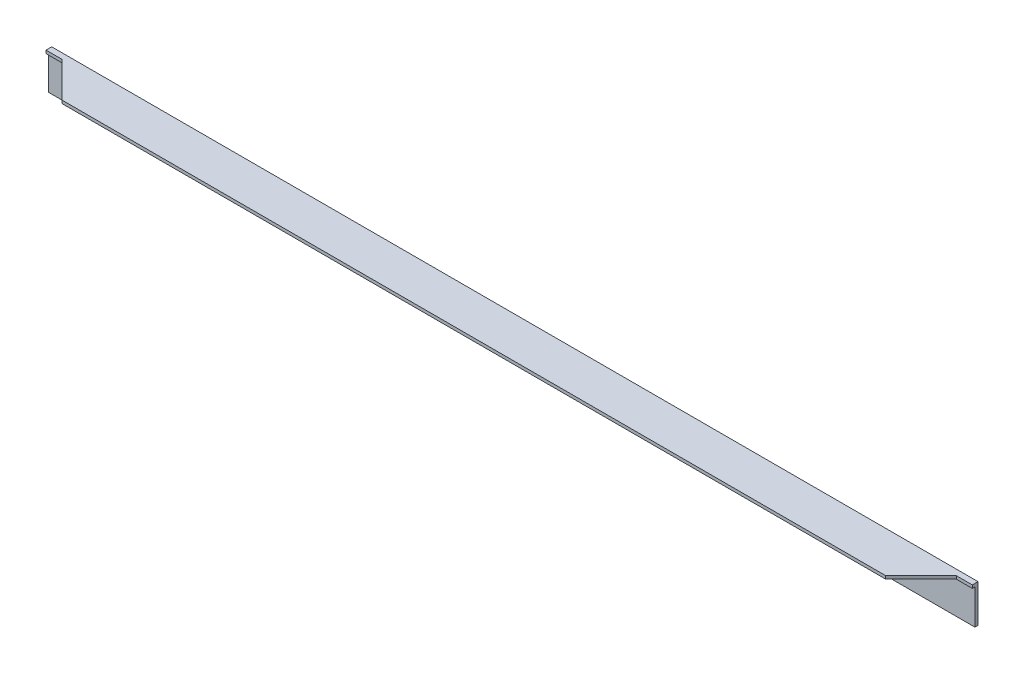
ISO-10303-21;
HEADER;
FILE_DESCRIPTION(('STEP AP214'),'2;1');
FILE_NAME('part.step','',(''),(''),'','','');
FILE_SCHEMA(('AUTOMOTIVE_DESIGN { 1 0 10303 214 1 1 1 1 }'));
ENDSEC;
DATA;
#1=APPLICATION_CONTEXT('core data for automotive mechanical design processes');
#2=APPLICATION_PROTOCOL_DEFINITION('international standard','automotive_design',2000,#1);
#3=PRODUCT_CONTEXT('',#1,'mechanical');
#4=PRODUCT('Part','Part','',(#3));
#5=PRODUCT_RELATED_PRODUCT_CATEGORY('part','',(#4));
#6=PRODUCT_DEFINITION_FORMATION('','',#4);
#7=PRODUCT_DEFINITION_CONTEXT('part definition',#1,'design');
#8=PRODUCT_DEFINITION('design','',#6,#7);
#9=PRODUCT_DEFINITION_SHAPE('','',#8);
#10=(LENGTH_UNIT() NAMED_UNIT(*) SI_UNIT(.MILLI.,.METRE.));
#11=(NAMED_UNIT(*) PLANE_ANGLE_UNIT() SI_UNIT($,.RADIAN.));
#12=(NAMED_UNIT(*) SI_UNIT($,.STERADIAN.) SOLID_ANGLE_UNIT());
#13=UNCERTAINTY_MEASURE_WITH_UNIT(LENGTH_MEASURE(1.E-05),#10,'distance_accuracy_value','');
#14=(GEOMETRIC_REPRESENTATION_CONTEXT(3) GLOBAL_UNCERTAINTY_ASSIGNED_CONTEXT((#13)) GLOBAL_UNIT_ASSIGNED_CONTEXT((#10,
#11,#12)) REPRESENTATION_CONTEXT('',''));
#15=CARTESIAN_POINT('',(0.,0.,0.));
#16=DIRECTION('',(0.,0.,1.));
#17=DIRECTION('',(1.,0.,0.));
#18=AXIS2_PLACEMENT_3D('',#15,#16,#17);
#19=CARTESIAN_POINT('',(-1220.,100.,8.));
#20=DIRECTION('',(0.,0.,-1.));
#21=DIRECTION('',(-1.,0.,0.));
#22=AXIS2_PLACEMENT_3D('',#19,#20,#21);
#23=PLANE('',#22);
#24=DIRECTION('',(1.,0.,0.));
#25=VECTOR('',#24,1.);
#26=CARTESIAN_POINT('',(-1220.,92.,8.));
#27=LINE('',#26,#25);
#28=CARTESIAN_POINT('',(-1220.,92.,8.));
#29=VERTEX_POINT('',#28);
#30=CARTESIAN_POINT('',(1220.,92.,8.));
#31=VERTEX_POINT('',#30);
#32=EDGE_CURVE('E134',#29,#31,#27,.T.);
#33=ORIENTED_EDGE('',*,*,#32,.F.);
#34=DIRECTION('',(0.,-1.,0.));
#35=VECTOR('',#34,1.);
#36=CARTESIAN_POINT('',(-1220.,0.,8.));
#37=LINE('',#36,#35);
#38=CARTESIAN_POINT('',(-1220.,0.,8.));
#39=VERTEX_POINT('',#38);
#40=EDGE_CURVE('E175',#29,#39,#37,.T.);
#41=ORIENTED_EDGE('',*,*,#40,.T.);
#42=DIRECTION('',(1.,0.,0.));
#43=VECTOR('',#42,1.);
#44=CARTESIAN_POINT('',(-1220.,0.,8.));
#45=LINE('',#44,#43);
#46=CARTESIAN_POINT('',(1220.,0.,8.));
#47=VERTEX_POINT('',#46);
#48=EDGE_CURVE('E185',#39,#47,#45,.T.);
#49=ORIENTED_EDGE('',*,*,#48,.T.);
#50=DIRECTION('',(0.,1.,0.));
#51=VECTOR('',#50,1.);
#52=CARTESIAN_POINT('',(1220.,0.,8.));
#53=LINE('',#52,#51);
#54=EDGE_CURVE('E147',#47,#31,#53,.T.);
#55=ORIENTED_EDGE('',*,*,#54,.T.);
#56=EDGE_LOOP('',(#33,#41,#49,#55));
#57=FACE_BOUND('',#56,.T.);
#58=ADVANCED_FACE('F34',(#57),#23,.F.);
#59=CARTESIAN_POINT('',(-1220.,0.,8.));
#60=DIRECTION('',(1.,0.,0.));
#61=DIRECTION('',(0.,0.,-1.));
#62=AXIS2_PLACEMENT_3D('',#59,#60,#61);
#63=PLANE('',#62);
#64=DIRECTION('',(0.,0.,-1.));
#65=VECTOR('',#64,1.);
#66=CARTESIAN_POINT('',(-1220.,92.,108.));
#67=LINE('',#66,#65);
#68=CARTESIAN_POINT('',(-1220.,92.,15.));
#69=VERTEX_POINT('',#68);
#70=EDGE_CURVE('E132',#69,#29,#67,.T.);
#71=ORIENTED_EDGE('',*,*,#70,.F.);
#72=DIRECTION('',(0.,1.,0.));
#73=VECTOR('',#72,1.);
#74=CARTESIAN_POINT('',(-1220.,-2.50000000007189E-05,15.));
#75=LINE('',#74,#73);
#76=CARTESIAN_POINT('',(-1220.,100.,15.));
#77=VERTEX_POINT('',#76);
#78=EDGE_CURVE('E212',#69,#77,#75,.T.);
#79=ORIENTED_EDGE('',*,*,#78,.T.);
#80=DIRECTION('',(0.,0.,-1.));
#81=VECTOR('',#80,1.);
#82=CARTESIAN_POINT('',(-1220.,100.,8.));
#83=LINE('',#82,#81);
#84=CARTESIAN_POINT('',(-1220.,100.,0.));
#85=VERTEX_POINT('',#84);
#86=EDGE_CURVE('E176',#77,#85,#83,.T.);
#87=ORIENTED_EDGE('',*,*,#86,.T.);
#88=DIRECTION('',(0.,-1.,0.));
#89=VECTOR('',#88,1.);
#90=CARTESIAN_POINT('',(-1220.,0.,0.));
#91=LINE('',#90,#89);
#92=CARTESIAN_POINT('',(-1220.,0.,0.));
#93=VERTEX_POINT('',#92);
#94=EDGE_CURVE('E156',#85,#93,#91,.T.);
#95=ORIENTED_EDGE('',*,*,#94,.T.);
#96=DIRECTION('',(0.,0.,-1.));
#97=VECTOR('',#96,1.);
#98=CARTESIAN_POINT('',(-1220.,0.,8.));
#99=LINE('',#98,#97);
#100=EDGE_CURVE('E183',#39,#93,#99,.T.);
#101=ORIENTED_EDGE('',*,*,#100,.F.);
#102=ORIENTED_EDGE('',*,*,#40,.F.);
#103=EDGE_LOOP('',(#71,#79,#87,#95,#101,#102));
#104=FACE_BOUND('',#103,.T.);
#105=ADVANCED_FACE('F36',(#104),#63,.F.);
#106=CARTESIAN_POINT('',(-1220.,0.,8.));
#107=DIRECTION('',(0.,1.,0.));
#108=DIRECTION('',(0.,0.,1.));
#109=AXIS2_PLACEMENT_3D('',#106,#107,#108);
#110=PLANE('',#109);
#111=DIRECTION('',(1.,0.,0.));
#112=VECTOR('',#111,1.);
#113=CARTESIAN_POINT('',(-1220.,0.,0.));
#114=LINE('',#113,#112);
#115=CARTESIAN_POINT('',(1220.,0.,0.));
#116=VERTEX_POINT('',#115);
#117=EDGE_CURVE('E161',#93,#116,#114,.T.);
#118=ORIENTED_EDGE('',*,*,#117,.T.);
#119=DIRECTION('',(0.,0.,-1.));
#120=VECTOR('',#119,1.);
#121=CARTESIAN_POINT('',(1220.,0.,8.));
#122=LINE('',#121,#120);
#123=EDGE_CURVE('E180',#47,#116,#122,.T.);
#124=ORIENTED_EDGE('',*,*,#123,.F.);
#125=ORIENTED_EDGE('',*,*,#48,.F.);
#126=ORIENTED_EDGE('',*,*,#100,.T.);
#127=EDGE_LOOP('',(#118,#124,#125,#126));
#128=FACE_BOUND('',#127,.T.);
#129=ADVANCED_FACE('F226',(#128),#110,.F.);
#130=CARTESIAN_POINT('',(1220.,0.,8.));
#131=DIRECTION('',(-1.,0.,0.));
#132=DIRECTION('',(0.,0.,1.));
#133=AXIS2_PLACEMENT_3D('',#130,#131,#132);
#134=PLANE('',#133);
#135=DIRECTION('',(0.,0.,-1.));
#136=VECTOR('',#135,1.);
#137=CARTESIAN_POINT('',(1220.,100.,8.));
#138=LINE('',#137,#136);
#139=CARTESIAN_POINT('',(1220.,100.,15.));
#140=VERTEX_POINT('',#139);
#141=CARTESIAN_POINT('',(1220.,100.,0.));
#142=VERTEX_POINT('',#141);
#143=EDGE_CURVE('E178',#140,#142,#138,.T.);
#144=ORIENTED_EDGE('',*,*,#143,.F.);
#145=DIRECTION('',(0.,1.,0.));
#146=VECTOR('',#145,1.);
#147=CARTESIAN_POINT('',(1220.,-2.50000000007189E-05,15.));
#148=LINE('',#147,#146);
#149=CARTESIAN_POINT('',(1220.,92.,15.));
#150=VERTEX_POINT('',#149);
#151=EDGE_CURVE('E199',#150,#140,#148,.T.);
#152=ORIENTED_EDGE('',*,*,#151,.F.);
#153=DIRECTION('',(0.,0.,-1.));
#154=VECTOR('',#153,1.);
#155=CARTESIAN_POINT('',(1220.,92.,108.));
#156=LINE('',#155,#154);
#157=EDGE_CURVE('E129',#150,#31,#156,.T.);
#158=ORIENTED_EDGE('',*,*,#157,.T.);
#159=ORIENTED_EDGE('',*,*,#54,.F.);
#160=ORIENTED_EDGE('',*,*,#123,.T.);
#161=DIRECTION('',(0.,1.,0.));
#162=VECTOR('',#161,1.);
#163=CARTESIAN_POINT('',(1220.,0.,0.));
#164=LINE('',#163,#162);
#165=EDGE_CURVE('E166',#116,#142,#164,.T.);
#166=ORIENTED_EDGE('',*,*,#165,.T.);
#167=EDGE_LOOP('',(#144,#152,#158,#159,#160,#166));
#168=FACE_BOUND('',#167,.T.);
#169=ADVANCED_FACE('F198',(#168),#134,.F.);
#170=CARTESIAN_POINT('',(-1220.,100.,8.));
#171=DIRECTION('',(0.,-1.,0.));
#172=DIRECTION('',(0.,0.,-1.));
#173=AXIS2_PLACEMENT_3D('',#170,#171,#172);
#174=PLANE('',#173);
#175=ORIENTED_EDGE('',*,*,#86,.F.);
#176=DIRECTION('',(-1.,0.,0.));
#177=VECTOR('',#176,1.);
#178=CARTESIAN_POINT('',(-1220.,100.,15.));
#179=LINE('',#178,#177);
#180=CARTESIAN_POINT('',(-1178.,100.,15.));
#181=VERTEX_POINT('',#180);
#182=EDGE_CURVE('E125',#181,#77,#179,.T.);
#183=ORIENTED_EDGE('',*,*,#182,.F.);
#184=DIRECTION('',(-0.707106781186552,0.,-0.707106781186543));
#185=VECTOR('',#184,1.);
#186=CARTESIAN_POINT('',(-1085.,100.,108.));
#187=LINE('',#186,#185);
#188=CARTESIAN_POINT('',(-1085.,100.,108.));
#189=VERTEX_POINT('',#188);
#190=EDGE_CURVE('E113',#189,#181,#187,.T.);
#191=ORIENTED_EDGE('',*,*,#190,.F.);
#192=DIRECTION('',(-1.,0.,0.));
#193=VECTOR('',#192,1.);
#194=CARTESIAN_POINT('',(-1220.,100.,108.));
#195=LINE('',#194,#193);
#196=CARTESIAN_POINT('',(1085.,100.,108.));
#197=VERTEX_POINT('',#196);
#198=EDGE_CURVE('E124',#197,#189,#195,.T.);
#199=ORIENTED_EDGE('',*,*,#198,.F.);
#200=DIRECTION('',(-0.707106781186551,0.,0.707106781186544));
#201=VECTOR('',#200,1.);
#202=CARTESIAN_POINT('',(1085.,100.,108.));
#203=LINE('',#202,#201);
#204=CARTESIAN_POINT('',(1178.,100.,15.));
#205=VERTEX_POINT('',#204);
#206=EDGE_CURVE('E57',#205,#197,#203,.T.);
#207=ORIENTED_EDGE('',*,*,#206,.F.);
#208=DIRECTION('',(-1.,0.,0.));
#209=VECTOR('',#208,1.);
#210=CARTESIAN_POINT('',(1220.,100.,15.));
#211=LINE('',#210,#209);
#212=EDGE_CURVE('E206',#140,#205,#211,.T.);
#213=ORIENTED_EDGE('',*,*,#212,.F.);
#214=ORIENTED_EDGE('',*,*,#143,.T.);
#215=DIRECTION('',(-1.,0.,0.));
#216=VECTOR('',#215,1.);
#217=CARTESIAN_POINT('',(-1220.,100.,0.));
#218=LINE('',#217,#216);
#219=EDGE_CURVE('E172',#142,#85,#218,.T.);
#220=ORIENTED_EDGE('',*,*,#219,.T.);
#221=EDGE_LOOP('',(#175,#183,#191,#199,#207,#213,#214,#220));
#222=FACE_BOUND('',#221,.T.);
#223=ADVANCED_FACE('F123',(#222),#174,.F.);
#224=CARTESIAN_POINT('',(-1220.,100.,0.));
#225=DIRECTION('',(0.,0.,-1.));
#226=DIRECTION('',(-1.,0.,0.));
#227=AXIS2_PLACEMENT_3D('',#224,#225,#226);
#228=PLANE('',#227);
#229=ORIENTED_EDGE('',*,*,#94,.F.);
#230=ORIENTED_EDGE('',*,*,#219,.F.);
#231=ORIENTED_EDGE('',*,*,#165,.F.);
#232=ORIENTED_EDGE('',*,*,#117,.F.);
#233=EDGE_LOOP('',(#229,#230,#231,#232));
#234=FACE_BOUND('',#233,.T.);
#235=ADVANCED_FACE('F224',(#234),#228,.T.);
#236=CARTESIAN_POINT('',(-1220.,92.,108.));
#237=DIRECTION('',(0.,1.,0.));
#238=DIRECTION('',(0.,0.,1.));
#239=AXIS2_PLACEMENT_3D('',#236,#237,#238);
#240=PLANE('',#239);
#241=DIRECTION('',(-0.707106781186552,0.,-0.707106781186543));
#242=VECTOR('',#241,1.);
#243=CARTESIAN_POINT('',(-1152.5,92.,40.5));
#244=LINE('',#243,#242);
#245=CARTESIAN_POINT('',(-1085.,92.,108.));
#246=VERTEX_POINT('',#245);
#247=CARTESIAN_POINT('',(-1178.,92.,15.));
#248=VERTEX_POINT('',#247);
#249=EDGE_CURVE('E49',#246,#248,#244,.T.);
#250=ORIENTED_EDGE('',*,*,#249,.T.);
#251=DIRECTION('',(-1.,0.,0.));
#252=VECTOR('',#251,1.);
#253=CARTESIAN_POINT('',(-1220.,92.,15.));
#254=LINE('',#253,#252);
#255=EDGE_CURVE('E11',#248,#69,#254,.T.);
#256=ORIENTED_EDGE('',*,*,#255,.T.);
#257=ORIENTED_EDGE('',*,*,#70,.T.);
#258=ORIENTED_EDGE('',*,*,#32,.T.);
#259=ORIENTED_EDGE('',*,*,#157,.F.);
#260=DIRECTION('',(-1.,0.,0.));
#261=VECTOR('',#260,1.);
#262=CARTESIAN_POINT('',(-1220.,92.,15.0000000000007));
#263=LINE('',#262,#261);
#264=CARTESIAN_POINT('',(1178.,92.,15.));
#265=VERTEX_POINT('',#264);
#266=EDGE_CURVE('E118',#150,#265,#263,.T.);
#267=ORIENTED_EDGE('',*,*,#266,.T.);
#268=DIRECTION('',(-0.707106781186551,0.,0.707106781186544));
#269=VECTOR('',#268,1.);
#270=CARTESIAN_POINT('',(-67.5000000000108,92.,1260.5));
#271=LINE('',#270,#269);
#272=CARTESIAN_POINT('',(1085.,92.,108.));
#273=VERTEX_POINT('',#272);
#274=EDGE_CURVE('E146',#265,#273,#271,.T.);
#275=ORIENTED_EDGE('',*,*,#274,.T.);
#276=DIRECTION('',(1.,0.,0.));
#277=VECTOR('',#276,1.);
#278=CARTESIAN_POINT('',(-1220.,92.,108.));
#279=LINE('',#278,#277);
#280=EDGE_CURVE('E130',#246,#273,#279,.T.);
#281=ORIENTED_EDGE('',*,*,#280,.F.);
#282=EDGE_LOOP('',(#250,#256,#257,#258,#259,#267,#275,#281));
#283=FACE_BOUND('',#282,.T.);
#284=ADVANCED_FACE('F194',(#283),#240,.F.);
#285=CARTESIAN_POINT('',(-1220.,92.,108.));
#286=DIRECTION('',(0.,0.,1.));
#287=DIRECTION('',(1.,0.,0.));
#288=AXIS2_PLACEMENT_3D('',#285,#286,#287);
#289=PLANE('',#288);
#290=DIRECTION('',(0.,1.,0.));
#291=VECTOR('',#290,1.);
#292=CARTESIAN_POINT('',(-1085.,92.,108.));
#293=LINE('',#292,#291);
#294=EDGE_CURVE('E42',#246,#189,#293,.T.);
#295=ORIENTED_EDGE('',*,*,#294,.F.);
#296=ORIENTED_EDGE('',*,*,#280,.T.);
#297=DIRECTION('',(0.,-1.,0.));
#298=VECTOR('',#297,1.);
#299=CARTESIAN_POINT('',(1085.,92.,108.));
#300=LINE('',#299,#298);
#301=EDGE_CURVE('E128',#197,#273,#300,.T.);
#302=ORIENTED_EDGE('',*,*,#301,.F.);
#303=ORIENTED_EDGE('',*,*,#198,.T.);
#304=EDGE_LOOP('',(#295,#296,#302,#303));
#305=FACE_BOUND('',#304,.T.);
#306=ADVANCED_FACE('F127',(#305),#289,.T.);
#307=CARTESIAN_POINT('',(1220.,-2.50000000007189E-05,15.));
#308=DIRECTION('',(0.,0.,-1.));
#309=DIRECTION('',(-1.,0.,0.));
#310=AXIS2_PLACEMENT_3D('',#307,#308,#309);
#311=PLANE('',#310);
#312=ORIENTED_EDGE('',*,*,#151,.T.);
#313=ORIENTED_EDGE('',*,*,#212,.T.);
#314=DIRECTION('',(0.,1.,0.));
#315=VECTOR('',#314,1.);
#316=CARTESIAN_POINT('',(1178.,-2.50000000007189E-05,15.));
#317=LINE('',#316,#315);
#318=EDGE_CURVE('E203',#265,#205,#317,.T.);
#319=ORIENTED_EDGE('',*,*,#318,.F.);
#320=ORIENTED_EDGE('',*,*,#266,.F.);
#321=EDGE_LOOP('',(#312,#313,#319,#320));
#322=FACE_BOUND('',#321,.T.);
#323=ADVANCED_FACE('F210',(#322),#311,.F.);
#324=CARTESIAN_POINT('',(1085.,-2.50000000007189E-05,108.));
#325=DIRECTION('',(-0.707106781186544,0.,-0.707106781186551));
#326=DIRECTION('',(-0.707106781186551,0.,0.707106781186544));
#327=AXIS2_PLACEMENT_3D('',#324,#325,#326);
#328=PLANE('',#327);
#329=ORIENTED_EDGE('',*,*,#318,.T.);
#330=ORIENTED_EDGE('',*,*,#206,.T.);
#331=ORIENTED_EDGE('',*,*,#301,.T.);
#332=ORIENTED_EDGE('',*,*,#274,.F.);
#333=EDGE_LOOP('',(#329,#330,#331,#332));
#334=FACE_BOUND('',#333,.T.);
#335=ADVANCED_FACE('F209',(#334),#328,.F.);
#336=CARTESIAN_POINT('',(-1220.,-2.50000000007189E-05,15.));
#337=DIRECTION('',(0.,0.,-1.));
#338=DIRECTION('',(-1.,0.,0.));
#339=AXIS2_PLACEMENT_3D('',#336,#337,#338);
#340=PLANE('',#339);
#341=DIRECTION('',(0.,1.,0.));
#342=VECTOR('',#341,1.);
#343=CARTESIAN_POINT('',(-1178.,-2.50000000007189E-05,15.));
#344=LINE('',#343,#342);
#345=EDGE_CURVE('E215',#248,#181,#344,.T.);
#346=ORIENTED_EDGE('',*,*,#345,.T.);
#347=ORIENTED_EDGE('',*,*,#182,.T.);
#348=ORIENTED_EDGE('',*,*,#78,.F.);
#349=ORIENTED_EDGE('',*,*,#255,.F.);
#350=EDGE_LOOP('',(#346,#347,#348,#349));
#351=FACE_BOUND('',#350,.T.);
#352=ADVANCED_FACE('F220',(#351),#340,.F.);
#353=CARTESIAN_POINT('',(-1085.,-2.50000000007189E-05,108.));
#354=DIRECTION('',(0.707106781186543,0.,-0.707106781186552));
#355=DIRECTION('',(-0.707106781186552,0.,-0.707106781186543));
#356=AXIS2_PLACEMENT_3D('',#353,#354,#355);
#357=PLANE('',#356);
#358=ORIENTED_EDGE('',*,*,#294,.T.);
#359=ORIENTED_EDGE('',*,*,#190,.T.);
#360=ORIENTED_EDGE('',*,*,#345,.F.);
#361=ORIENTED_EDGE('',*,*,#249,.F.);
#362=EDGE_LOOP('',(#358,#359,#360,#361));
#363=FACE_BOUND('',#362,.T.);
#364=ADVANCED_FACE('F112',(#363),#357,.F.);
#365=CLOSED_SHELL('',(#58,#105,#129,#169,#223,#235,#284,#306,#323,#335,#352,#364));
#366=MANIFOLD_SOLID_BREP('B2',#365);
#367=ADVANCED_BREP_SHAPE_REPRESENTATION('',(#18,#366),#14);
#368=SHAPE_DEFINITION_REPRESENTATION(#9,#367);
ENDSEC;
END-ISO-10303-21;
